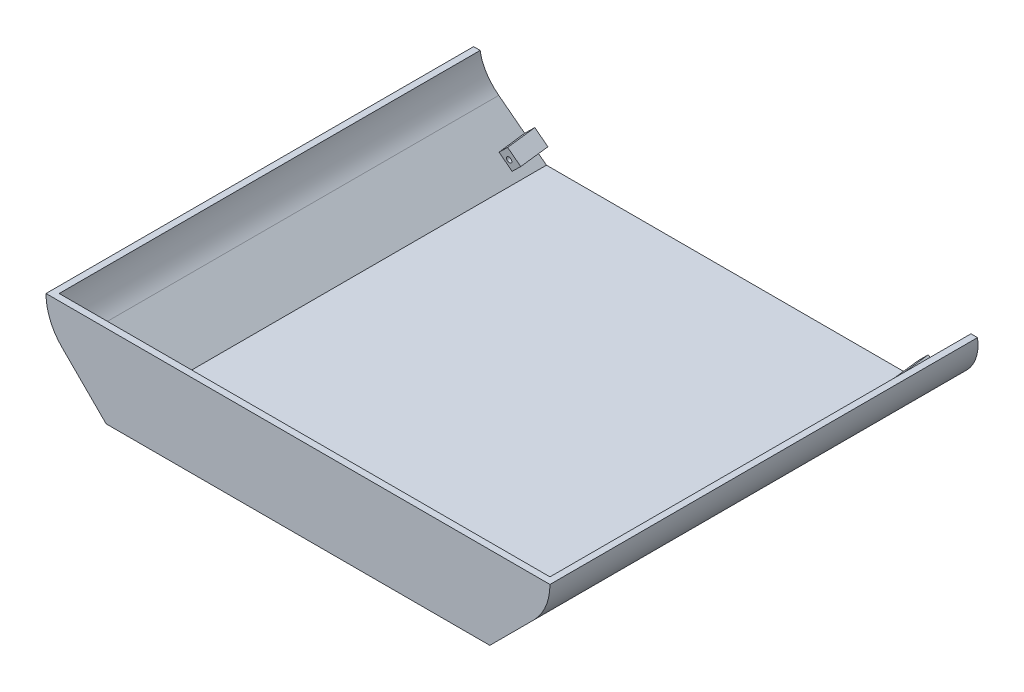
ISO-10303-21;
HEADER;
FILE_DESCRIPTION(('STEP AP214'),'2;1');
FILE_NAME('part.step','',(''),(''),'','','');
FILE_SCHEMA(('AUTOMOTIVE_DESIGN { 1 0 10303 214 1 1 1 1 }'));
ENDSEC;
DATA;
#1=APPLICATION_CONTEXT('core data for automotive mechanical design processes');
#2=APPLICATION_PROTOCOL_DEFINITION('international standard','automotive_design',2000,#1);
#3=PRODUCT_CONTEXT('',#1,'mechanical');
#4=PRODUCT('Part','Part','',(#3));
#5=PRODUCT_RELATED_PRODUCT_CATEGORY('part','',(#4));
#6=PRODUCT_DEFINITION_FORMATION('','',#4);
#7=PRODUCT_DEFINITION_CONTEXT('part definition',#1,'design');
#8=PRODUCT_DEFINITION('design','',#6,#7);
#9=PRODUCT_DEFINITION_SHAPE('','',#8);
#10=(LENGTH_UNIT() NAMED_UNIT(*) SI_UNIT(.MILLI.,.METRE.));
#11=(NAMED_UNIT(*) PLANE_ANGLE_UNIT() SI_UNIT($,.RADIAN.));
#12=(NAMED_UNIT(*) SI_UNIT($,.STERADIAN.) SOLID_ANGLE_UNIT());
#13=UNCERTAINTY_MEASURE_WITH_UNIT(LENGTH_MEASURE(1.E-05),#10,'distance_accuracy_value','');
#14=(GEOMETRIC_REPRESENTATION_CONTEXT(3) GLOBAL_UNCERTAINTY_ASSIGNED_CONTEXT((#13)) GLOBAL_UNIT_ASSIGNED_CONTEXT((#10,
#11,#12)) REPRESENTATION_CONTEXT('',''));
#15=CARTESIAN_POINT('',(0.,0.,0.));
#16=DIRECTION('',(0.,0.,1.));
#17=DIRECTION('',(1.,0.,0.));
#18=AXIS2_PLACEMENT_3D('',#15,#16,#17);
#19=CARTESIAN_POINT('',(170.757359312881,4.24264068711929,400.));
#20=DIRECTION('',(-0.707106781186546,0.707106781186549,0.));
#21=DIRECTION('',(-0.707106781186549,-0.707106781186546,0.));
#22=AXIS2_PLACEMENT_3D('',#19,#20,#21);
#23=PLANE('',#22);
#24=DIRECTION('',(0.704062592219638,0.704062592219636,0.0926915987235618));
#25=VECTOR('',#24,1.);
#26=CARTESIAN_POINT('',(195.179587109526,28.6648684837644,28.9895255434052));
#27=LINE('',#26,#25);
#28=CARTESIAN_POINT('',(177.909749068652,11.395030442891,26.7159082323946));
#29=VERTEX_POINT('',#28);
#30=CARTESIAN_POINT('',(188.470687951947,21.9559693261855,28.106282213248));
#31=VERTEX_POINT('',#30);
#32=EDGE_CURVE('E57',#29,#31,#27,.T.);
#33=ORIENTED_EDGE('',*,*,#32,.F.);
#34=DIRECTION('',(0.0655428580164528,0.0655428580164526,-0.995694866676569));
#35=VECTOR('',#34,1.);
#36=CARTESIAN_POINT('',(153.487521272007,-13.0271973537541,397.726382688989));
#37=LINE('',#36,#35);
#38=CARTESIAN_POINT('',(179.555344547958,13.0406259221963,1.71683097275991));
#39=VERTEX_POINT('',#38);
#40=EDGE_CURVE('E11',#29,#39,#37,.T.);
#41=ORIENTED_EDGE('',*,*,#40,.T.);
#42=DIRECTION('',(-0.704062592219638,-0.704062592219636,-0.0926915987235618));
#43=VECTOR('',#42,1.);
#44=CARTESIAN_POINT('',(196.825182588831,30.3104639630699,3.99044828377049));
#45=LINE('',#44,#43);
#46=CARTESIAN_POINT('',(172.514718625761,6.,0.789914985524294));
#47=VERTEX_POINT('',#46);
#48=EDGE_CURVE('E260',#39,#47,#45,.T.);
#49=ORIENTED_EDGE('',*,*,#48,.T.);
#50=DIRECTION('',(0.,0.,-1.));
#51=VECTOR('',#50,1.);
#52=CARTESIAN_POINT('',(172.514718625761,6.,400.));
#53=LINE('',#52,#51);
#54=CARTESIAN_POINT('',(172.514718625761,6.,394.));
#55=VERTEX_POINT('',#54);
#56=EDGE_CURVE('E241',#55,#47,#53,.T.);
#57=ORIENTED_EDGE('',*,*,#56,.F.);
#58=DIRECTION('',(0.707106781186549,0.707106781186546,0.));
#59=VECTOR('',#58,1.);
#60=CARTESIAN_POINT('',(170.757359312881,4.24264068711929,394.));
#61=LINE('',#60,#59);
#62=CARTESIAN_POINT('',(210.976193119776,44.4614744940144,394.));
#63=VERTEX_POINT('',#62);
#64=EDGE_CURVE('E236',#55,#63,#61,.T.);
#65=ORIENTED_EDGE('',*,*,#64,.T.);
#66=DIRECTION('',(0.,0.,-1.));
#67=VECTOR('',#66,1.);
#68=CARTESIAN_POINT('',(210.976193119776,44.4614744940144,400.));
#69=LINE('',#68,#67);
#70=CARTESIAN_POINT('',(210.976193119776,44.4614744940144,5.85346416355464));
#71=VERTEX_POINT('',#70);
#72=EDGE_CURVE('E231',#63,#71,#69,.T.);
#73=ORIENTED_EDGE('',*,*,#72,.T.);
#74=CARTESIAN_POINT('',(190.116283431252,23.601564805491,3.10720495361334));
#75=VERTEX_POINT('',#74);
#76=EDGE_CURVE('E258',#71,#75,#45,.T.);
#77=ORIENTED_EDGE('',*,*,#76,.T.);
#78=DIRECTION('',(-0.0655428580164527,-0.0655428580164525,0.995694866676569));
#79=VECTOR('',#78,1.);
#80=CARTESIAN_POINT('',(164.048460155302,-2.46625847045953,399.116756669843));
#81=LINE('',#80,#79);
#82=EDGE_CURVE('E47',#75,#31,#81,.T.);
#83=ORIENTED_EDGE('',*,*,#82,.T.);
#84=EDGE_LOOP('',(#33,#41,#49,#57,#65,#73,#77,#83));
#85=FACE_BOUND('',#84,.T.);
#86=ADVANCED_FACE('F38',(#85),#23,.T.);
#87=CARTESIAN_POINT('',(-170.757359312881,4.24264068711931,400.));
#88=DIRECTION('',(0.707106781186543,0.707106781186552,0.));
#89=DIRECTION('',(-0.707106781186552,0.707106781186543,0.));
#90=AXIS2_PLACEMENT_3D('',#87,#88,#89);
#91=PLANE('',#90);
#92=DIRECTION('',(-0.704062592219641,0.704062592219633,0.0926915987235614));
#93=VECTOR('',#92,1.);
#94=CARTESIAN_POINT('',(-196.825182588831,30.3104639630696,3.99044828377049));
#95=LINE('',#94,#93);
#96=CARTESIAN_POINT('',(-172.514718625761,6.,0.789914985524294));
#97=VERTEX_POINT('',#96);
#98=CARTESIAN_POINT('',(-179.555344547958,13.0406259221963,1.71683097275993));
#99=VERTEX_POINT('',#98);
#100=EDGE_CURVE('E263',#97,#99,#95,.T.);
#101=ORIENTED_EDGE('',*,*,#100,.T.);
#102=DIRECTION('',(0.0655428580164531,-0.0655428580164523,0.995694866676569));
#103=VECTOR('',#102,1.);
#104=CARTESIAN_POINT('',(-153.487521272007,-13.027197353754,397.726382688989));
#105=LINE('',#104,#103);
#106=CARTESIAN_POINT('',(-177.909749068652,11.3950304428909,26.7159082323946));
#107=VERTEX_POINT('',#106);
#108=EDGE_CURVE('E331',#99,#107,#105,.T.);
#109=ORIENTED_EDGE('',*,*,#108,.T.);
#110=DIRECTION('',(-0.704062592219642,0.704062592219633,0.0926915987235614));
#111=VECTOR('',#110,1.);
#112=CARTESIAN_POINT('',(-195.179587109526,28.6648684837642,28.9895255434052));
#113=LINE('',#112,#111);
#114=CARTESIAN_POINT('',(-188.470687951947,21.9559693261854,28.106282213248));
#115=VERTEX_POINT('',#114);
#116=EDGE_CURVE('E326',#107,#115,#113,.T.);
#117=ORIENTED_EDGE('',*,*,#116,.T.);
#118=DIRECTION('',(-0.065542858016453,0.0655428580164522,-0.995694866676569));
#119=VECTOR('',#118,1.);
#120=CARTESIAN_POINT('',(-164.048460155302,-2.46625847045949,399.116756669843));
#121=LINE('',#120,#119);
#122=CARTESIAN_POINT('',(-190.116283431252,23.6015648054908,3.10720495361333));
#123=VERTEX_POINT('',#122);
#124=EDGE_CURVE('E328',#115,#123,#121,.T.);
#125=ORIENTED_EDGE('',*,*,#124,.T.);
#126=CARTESIAN_POINT('',(-210.976193119776,44.4614744940139,5.85346416355459));
#127=VERTEX_POINT('',#126);
#128=EDGE_CURVE('E266',#123,#127,#95,.T.);
#129=ORIENTED_EDGE('',*,*,#128,.T.);
#130=DIRECTION('',(0.,0.,1.));
#131=VECTOR('',#130,1.);
#132=CARTESIAN_POINT('',(-210.976193119776,44.4614744940139,400.));
#133=LINE('',#132,#131);
#134=CARTESIAN_POINT('',(-210.976193119776,44.4614744940139,394.));
#135=VERTEX_POINT('',#134);
#136=EDGE_CURVE('E253',#135,#127,#133,.F.);
#137=ORIENTED_EDGE('',*,*,#136,.F.);
#138=DIRECTION('',(0.707106781186552,-0.707106781186543,0.));
#139=VECTOR('',#138,1.);
#140=CARTESIAN_POINT('',(-170.757359312881,4.24264068711931,394.));
#141=LINE('',#140,#139);
#142=CARTESIAN_POINT('',(-172.514718625761,6.,394.));
#143=VERTEX_POINT('',#142);
#144=EDGE_CURVE('E248',#135,#143,#141,.T.);
#145=ORIENTED_EDGE('',*,*,#144,.T.);
#146=DIRECTION('',(0.,0.,-1.));
#147=VECTOR('',#146,1.);
#148=CARTESIAN_POINT('',(-172.514718625761,6.,400.));
#149=LINE('',#148,#147);
#150=EDGE_CURVE('E244',#143,#97,#149,.T.);
#151=ORIENTED_EDGE('',*,*,#150,.T.);
#152=EDGE_LOOP('',(#101,#109,#117,#125,#129,#137,#145,#151));
#153=FACE_BOUND('',#152,.T.);
#154=ADVANCED_FACE('F365',(#153),#91,.T.);
#155=CARTESIAN_POINT('',(175.,0.,400.));
#156=DIRECTION('',(-0.707106781186546,0.707106781186549,0.));
#157=DIRECTION('',(-0.707106781186549,-0.707106781186546,0.));
#158=AXIS2_PLACEMENT_3D('',#155,#156,#157);
#159=PLANE('',#158);
#160=DIRECTION('',(-0.704062592219638,-0.704062592219636,-0.0926915987235618));
#161=VECTOR('',#160,1.);
#162=CARTESIAN_POINT('',(201.104274909717,26.1042749097173,3.43669298957194));
#163=LINE('',#162,#161);
#164=CARTESIAN_POINT('',(215.218833806895,40.2188338068951,5.29490992072962));
#165=VERTEX_POINT('',#164);
#166=CARTESIAN_POINT('',(175.,0.,0.));
#167=VERTEX_POINT('',#166);
#168=EDGE_CURVE('E292',#165,#167,#163,.T.);
#169=ORIENTED_EDGE('',*,*,#168,.F.);
#170=DIRECTION('',(0.,0.,-1.));
#171=VECTOR('',#170,1.);
#172=CARTESIAN_POINT('',(215.218833806895,40.2188338068951,400.));
#173=LINE('',#172,#171);
#174=CARTESIAN_POINT('',(215.218833806895,40.2188338068951,400.));
#175=VERTEX_POINT('',#174);
#176=EDGE_CURVE('E323',#175,#165,#173,.T.);
#177=ORIENTED_EDGE('',*,*,#176,.F.);
#178=DIRECTION('',(0.707106781186549,0.707106781186546,0.));
#179=VECTOR('',#178,1.);
#180=CARTESIAN_POINT('',(175.,0.,400.));
#181=LINE('',#180,#179);
#182=CARTESIAN_POINT('',(175.,0.,400.));
#183=VERTEX_POINT('',#182);
#184=EDGE_CURVE('E295',#183,#175,#181,.T.);
#185=ORIENTED_EDGE('',*,*,#184,.F.);
#186=DIRECTION('',(0.,0.,-1.));
#187=VECTOR('',#186,1.);
#188=CARTESIAN_POINT('',(175.,0.,400.));
#189=LINE('',#188,#187);
#190=EDGE_CURVE('E307',#183,#167,#189,.T.);
#191=ORIENTED_EDGE('',*,*,#190,.T.);
#192=EDGE_LOOP('',(#169,#177,#185,#191));
#193=FACE_BOUND('',#192,.T.);
#194=ADVANCED_FACE('F40',(#193),#159,.F.);
#195=CARTESIAN_POINT('',(179.863494747568,75.5741728662225,400.));
#196=DIRECTION('',(0.,0.,-1.));
#197=DIRECTION('',(-1.,0.,0.));
#198=AXIS2_PLACEMENT_3D('',#195,#196,#197);
#199=CYLINDRICAL_SURFACE('',#198,50.);
#200=CARTESIAN_POINT('',(179.863494747568,75.5741728662225,9.94952861093878));
#201=DIRECTION('',(0.,0.130526192220038,-0.991444861373812));
#202=DIRECTION('',(0.,-0.991444861373812,-0.130526192220038));
#203=AXIS2_PLACEMENT_3D('',#200,#201,#202);
#204=ELLIPSE('',#203,50.4314480290075,50.);
#205=CARTESIAN_POINT('',(229.863494747568,75.5741721608928,9.94952851808034));
#206=VERTEX_POINT('',#205);
#207=EDGE_CURVE('E290',#206,#165,#204,.T.);
#208=ORIENTED_EDGE('',*,*,#207,.F.);
#209=DIRECTION('',(0.,0.,-1.));
#210=VECTOR('',#209,1.);
#211=CARTESIAN_POINT('',(229.863494747568,75.5741720841793,400.));
#212=LINE('',#211,#210);
#213=CARTESIAN_POINT('',(229.863494747568,75.5741720841793,400.));
#214=VERTEX_POINT('',#213);
#215=EDGE_CURVE('E321',#214,#206,#212,.T.);
#216=ORIENTED_EDGE('',*,*,#215,.F.);
#217=CARTESIAN_POINT('',(179.863494747568,75.5741728662225,400.));
#218=DIRECTION('',(0.,0.,1.));
#219=DIRECTION('',(1.,0.,0.));
#220=AXIS2_PLACEMENT_3D('',#217,#218,#219);
#221=CIRCLE('',#220,50.);
#222=EDGE_CURVE('E298',#175,#214,#221,.T.);
#223=ORIENTED_EDGE('',*,*,#222,.F.);
#224=ORIENTED_EDGE('',*,*,#176,.T.);
#225=EDGE_LOOP('',(#208,#216,#223,#224));
#226=FACE_BOUND('',#225,.T.);
#227=ADVANCED_FACE('F409',(#226),#199,.T.);
#228=CARTESIAN_POINT('',(-179.863494747568,75.5741728662222,400.));
#229=DIRECTION('',(0.,0.,-1.));
#230=DIRECTION('',(-1.,0.,0.));
#231=AXIS2_PLACEMENT_3D('',#228,#229,#230);
#232=CYLINDRICAL_SURFACE('',#231,50.);
#233=CARTESIAN_POINT('',(-179.863494747568,75.5741728662222,9.94952861093873));
#234=DIRECTION('',(0.,0.130526192220038,-0.991444861373812));
#235=DIRECTION('',(0.,-0.991444861373812,-0.130526192220038));
#236=AXIS2_PLACEMENT_3D('',#233,#234,#235);
#237=ELLIPSE('',#236,50.4314480290075,50.);
#238=CARTESIAN_POINT('',(-215.218833806895,40.2188338068946,5.29490992072952));
#239=VERTEX_POINT('',#238);
#240=CARTESIAN_POINT('',(-229.863494747568,75.5741721608927,9.94952851808034));
#241=VERTEX_POINT('',#240);
#242=EDGE_CURVE('E287',#239,#241,#237,.T.);
#243=ORIENTED_EDGE('',*,*,#242,.F.);
#244=DIRECTION('',(0.,0.,-1.));
#245=VECTOR('',#244,1.);
#246=CARTESIAN_POINT('',(-215.218833806895,40.2188338068946,400.));
#247=LINE('',#246,#245);
#248=CARTESIAN_POINT('',(-215.218833806895,40.2188338068946,400.));
#249=VERTEX_POINT('',#248);
#250=EDGE_CURVE('E315',#249,#239,#247,.T.);
#251=ORIENTED_EDGE('',*,*,#250,.F.);
#252=CARTESIAN_POINT('',(-179.863494747568,75.5741728662222,400.));
#253=DIRECTION('',(0.,0.,1.));
#254=DIRECTION('',(-1.,0.,0.));
#255=AXIS2_PLACEMENT_3D('',#252,#253,#254);
#256=CIRCLE('',#255,50.);
#257=CARTESIAN_POINT('',(-229.863494747568,75.5741720841793,400.));
#258=VERTEX_POINT('',#257);
#259=EDGE_CURVE('E301',#258,#249,#256,.T.);
#260=ORIENTED_EDGE('',*,*,#259,.F.);
#261=DIRECTION('',(0.,0.,-1.));
#262=VECTOR('',#261,1.);
#263=CARTESIAN_POINT('',(-229.863494747568,75.5741720841793,400.));
#264=LINE('',#263,#262);
#265=EDGE_CURVE('E318',#258,#241,#264,.T.);
#266=ORIENTED_EDGE('',*,*,#265,.T.);
#267=EDGE_LOOP('',(#243,#251,#260,#266));
#268=FACE_BOUND('',#267,.T.);
#269=ADVANCED_FACE('F406',(#268),#232,.T.);
#270=CARTESIAN_POINT('',(-175.,0.,400.));
#271=DIRECTION('',(0.707106781186543,0.707106781186552,0.));
#272=DIRECTION('',(-0.707106781186552,0.707106781186543,0.));
#273=AXIS2_PLACEMENT_3D('',#270,#271,#272);
#274=PLANE('',#273);
#275=DIRECTION('',(-0.704062592219641,0.704062592219633,0.0926915987235614));
#276=VECTOR('',#275,1.);
#277=CARTESIAN_POINT('',(-201.104274909717,26.1042749097171,3.43669298957189));
#278=LINE('',#277,#276);
#279=CARTESIAN_POINT('',(-175.,0.,0.));
#280=VERTEX_POINT('',#279);
#281=EDGE_CURVE('E285',#280,#239,#278,.T.);
#282=ORIENTED_EDGE('',*,*,#281,.F.);
#283=DIRECTION('',(0.,0.,-1.));
#284=VECTOR('',#283,1.);
#285=CARTESIAN_POINT('',(-175.,0.,400.));
#286=LINE('',#285,#284);
#287=CARTESIAN_POINT('',(-175.,0.,400.));
#288=VERTEX_POINT('',#287);
#289=EDGE_CURVE('E312',#288,#280,#286,.T.);
#290=ORIENTED_EDGE('',*,*,#289,.F.);
#291=DIRECTION('',(0.707106781186552,-0.707106781186543,0.));
#292=VECTOR('',#291,1.);
#293=CARTESIAN_POINT('',(-175.,0.,400.));
#294=LINE('',#293,#292);
#295=EDGE_CURVE('E303',#249,#288,#294,.T.);
#296=ORIENTED_EDGE('',*,*,#295,.F.);
#297=ORIENTED_EDGE('',*,*,#250,.T.);
#298=EDGE_LOOP('',(#282,#290,#296,#297));
#299=FACE_BOUND('',#298,.T.);
#300=ADVANCED_FACE('F402',(#299),#274,.F.);
#301=CARTESIAN_POINT('',(-175.,0.,400.));
#302=DIRECTION('',(0.,1.,0.));
#303=DIRECTION('',(-1.,0.,0.));
#304=AXIS2_PLACEMENT_3D('',#301,#302,#303);
#305=PLANE('',#304);
#306=DIRECTION('',(1.,0.,0.));
#307=VECTOR('',#306,1.);
#308=CARTESIAN_POINT('',(-175.,0.,0.));
#309=LINE('',#308,#307);
#310=EDGE_CURVE('E294',#280,#167,#309,.T.);
#311=ORIENTED_EDGE('',*,*,#310,.T.);
#312=ORIENTED_EDGE('',*,*,#190,.F.);
#313=DIRECTION('',(1.,0.,0.));
#314=VECTOR('',#313,1.);
#315=CARTESIAN_POINT('',(-175.,0.,400.));
#316=LINE('',#315,#314);
#317=EDGE_CURVE('E305',#288,#183,#316,.T.);
#318=ORIENTED_EDGE('',*,*,#317,.F.);
#319=ORIENTED_EDGE('',*,*,#289,.T.);
#320=EDGE_LOOP('',(#311,#312,#318,#319));
#321=FACE_BOUND('',#320,.T.);
#322=ADVANCED_FACE('F398',(#321),#305,.F.);
#323=CARTESIAN_POINT('',(179.863494747568,75.5741728662225,400.));
#324=DIRECTION('',(0.,0.,1.));
#325=DIRECTION('',(1.,0.,0.));
#326=AXIS2_PLACEMENT_3D('',#323,#324,#325);
#327=PLANE('',#326);
#328=DIRECTION('',(1.,0.,0.));
#329=VECTOR('',#328,1.);
#330=CARTESIAN_POINT('',(-310.,75.5741720841793,400.));
#331=LINE('',#330,#329);
#332=EDGE_CURVE('E234',#258,#214,#331,.T.);
#333=ORIENTED_EDGE('',*,*,#332,.F.);
#334=ORIENTED_EDGE('',*,*,#259,.T.);
#335=ORIENTED_EDGE('',*,*,#295,.T.);
#336=ORIENTED_EDGE('',*,*,#317,.T.);
#337=ORIENTED_EDGE('',*,*,#184,.T.);
#338=ORIENTED_EDGE('',*,*,#222,.T.);
#339=EDGE_LOOP('',(#333,#334,#335,#336,#337,#338));
#340=FACE_BOUND('',#339,.T.);
#341=ADVANCED_FACE('F395',(#340),#327,.T.);
#342=CARTESIAN_POINT('',(0.,0.,0.));
#343=DIRECTION('',(0.,0.130526192220038,-0.991444861373812));
#344=DIRECTION('',(0.,0.991444861373812,0.130526192220038));
#345=AXIS2_PLACEMENT_3D('',#342,#343,#344);
#346=PLANE('',#345);
#347=CARTESIAN_POINT('',(179.509779585301,23.5563896574063,3.10125753253912));
#348=DIRECTION('',(0.,-0.130526192220038,0.991444861373812));
#349=DIRECTION('',(0.,-0.991444861373812,-0.130526192220038));
#350=AXIS2_PLACEMENT_3D('',#347,#348,#349);
#351=CIRCLE('',#350,2.5);
#352=CARTESIAN_POINT('',(179.509779585301,21.0777775039718,2.77494205198902));
#353=VERTEX_POINT('',#352);
#354=EDGE_CURVE('E336',#353,#353,#351,.T.);
#355=ORIENTED_EDGE('',*,*,#354,.T.);
#356=EDGE_LOOP('',(#355));
#357=FACE_BOUND('',#356,.T.);
#358=CARTESIAN_POINT('',(-179.509779585301,23.5563896574063,3.10125753253912));
#359=DIRECTION('',(0.,-0.130526192220038,0.991444861373812));
#360=DIRECTION('',(0.,0.991444861373812,0.130526192220038));
#361=AXIS2_PLACEMENT_3D('',#358,#359,#360);
#362=CIRCLE('',#361,2.5);
#363=CARTESIAN_POINT('',(-179.509779585301,26.0350018108408,3.42757301308922));
#364=VERTEX_POINT('',#363);
#365=EDGE_CURVE('E341',#364,#364,#362,.T.);
#366=ORIENTED_EDGE('',*,*,#365,.T.);
#367=EDGE_LOOP('',(#366));
#368=FACE_BOUND('',#367,.T.);
#369=DIRECTION('',(-1.,0.,0.));
#370=VECTOR('',#369,1.);
#371=CARTESIAN_POINT('',(0.,75.5741721608927,9.94952851808035));
#372=LINE('',#371,#370);
#373=CARTESIAN_POINT('',(223.863494747568,75.5741721608927,9.94952851808037));
#374=VERTEX_POINT('',#373);
#375=EDGE_CURVE('E230',#206,#374,#372,.T.);
#376=ORIENTED_EDGE('',*,*,#375,.F.);
#377=ORIENTED_EDGE('',*,*,#207,.T.);
#378=ORIENTED_EDGE('',*,*,#168,.T.);
#379=ORIENTED_EDGE('',*,*,#310,.F.);
#380=ORIENTED_EDGE('',*,*,#281,.T.);
#381=ORIENTED_EDGE('',*,*,#242,.T.);
#382=CARTESIAN_POINT('',(-223.863494747568,75.5741721608927,9.94952851808034));
#383=VERTEX_POINT('',#382);
#384=EDGE_CURVE('E228',#383,#241,#372,.T.);
#385=ORIENTED_EDGE('',*,*,#384,.F.);
#386=CARTESIAN_POINT('',(-179.863494747568,75.5741728662222,9.94952861093873));
#387=DIRECTION('',(0.,0.130526192220038,-0.991444861373812));
#388=DIRECTION('',(0.,-0.991444861373812,-0.130526192220038));
#389=AXIS2_PLACEMENT_3D('',#386,#387,#388);
#390=ELLIPSE('',#389,44.3796742655266,44.);
#391=EDGE_CURVE('E265',#127,#383,#390,.T.);
#392=ORIENTED_EDGE('',*,*,#391,.F.);
#393=ORIENTED_EDGE('',*,*,#128,.F.);
#394=DIRECTION('',(-0.710137920573855,-0.69803923914169,-0.0918986092469996));
#395=VECTOR('',#394,1.);
#396=CARTESIAN_POINT('',(-190.116283431252,23.6015648054908,3.10720495361333));
#397=LINE('',#396,#395);
#398=CARTESIAN_POINT('',(-179.464214622645,34.0721533926162,4.48568409231832));
#399=VERTEX_POINT('',#398);
#400=EDGE_CURVE('E214',#399,#123,#397,.T.);
#401=ORIENTED_EDGE('',*,*,#400,.F.);
#402=DIRECTION('',(-0.704062592219642,0.704062592219632,0.0926915987235613));
#403=VECTOR('',#402,1.);
#404=CARTESIAN_POINT('',(-179.464214622645,34.0721533926162,4.48568409231832));
#405=LINE('',#404,#403);
#406=CARTESIAN_POINT('',(-168.90327573935,23.5112145093217,3.0953101114649));
#407=VERTEX_POINT('',#406);
#408=EDGE_CURVE('E202',#407,#399,#405,.T.);
#409=ORIENTED_EDGE('',*,*,#408,.F.);
#410=DIRECTION('',(0.710137920573856,0.698039239141689,0.0918986092469994));
#411=VECTOR('',#410,1.);
#412=CARTESIAN_POINT('',(-168.90327573935,23.5112145093217,3.0953101114649));
#413=LINE('',#412,#411);
#414=EDGE_CURVE('E199',#99,#407,#413,.T.);
#415=ORIENTED_EDGE('',*,*,#414,.F.);
#416=ORIENTED_EDGE('',*,*,#100,.F.);
#417=DIRECTION('',(1.,0.,0.));
#418=VECTOR('',#417,1.);
#419=CARTESIAN_POINT('',(0.,6.,0.789914985524294));
#420=LINE('',#419,#418);
#421=EDGE_CURVE('E240',#97,#47,#420,.T.);
#422=ORIENTED_EDGE('',*,*,#421,.T.);
#423=ORIENTED_EDGE('',*,*,#48,.F.);
#424=DIRECTION('',(0.710137920573856,-0.698039239141689,-0.0918986092469994));
#425=VECTOR('',#424,1.);
#426=CARTESIAN_POINT('',(168.90327573935,23.5112145093217,3.0953101114649));
#427=LINE('',#426,#425);
#428=CARTESIAN_POINT('',(168.90327573935,23.5112145093217,3.0953101114649));
#429=VERTEX_POINT('',#428);
#430=EDGE_CURVE('E183',#429,#39,#427,.T.);
#431=ORIENTED_EDGE('',*,*,#430,.F.);
#432=DIRECTION('',(-0.704062592219642,-0.704062592219632,-0.0926915987235613));
#433=VECTOR('',#432,1.);
#434=CARTESIAN_POINT('',(179.464214622645,34.0721533926162,4.48568409231832));
#435=LINE('',#434,#433);
#436=CARTESIAN_POINT('',(179.464214622645,34.0721533926162,4.48568409231832));
#437=VERTEX_POINT('',#436);
#438=EDGE_CURVE('E190',#437,#429,#435,.T.);
#439=ORIENTED_EDGE('',*,*,#438,.F.);
#440=DIRECTION('',(-0.710137920573855,0.69803923914169,0.0918986092469996));
#441=VECTOR('',#440,1.);
#442=CARTESIAN_POINT('',(190.116283431252,23.6015648054908,3.10720495361333));
#443=LINE('',#442,#441);
#444=EDGE_CURVE('E174',#75,#437,#443,.T.);
#445=ORIENTED_EDGE('',*,*,#444,.F.);
#446=ORIENTED_EDGE('',*,*,#76,.F.);
#447=CARTESIAN_POINT('',(179.863494747568,75.5741728662225,9.94952861093878));
#448=DIRECTION('',(0.,0.130526192220038,-0.991444861373812));
#449=DIRECTION('',(0.,-0.991444861373812,-0.130526192220038));
#450=AXIS2_PLACEMENT_3D('',#447,#448,#449);
#451=ELLIPSE('',#450,44.3796742655266,44.);
#452=EDGE_CURVE('E269',#374,#71,#451,.T.);
#453=ORIENTED_EDGE('',*,*,#452,.F.);
#454=EDGE_LOOP('',(#376,#377,#378,#379,#380,#381,#385,#392,#393,#401,#409,#415,#416,#422,#423,
#431,#439,#445,#446,#453));
#455=FACE_BOUND('',#454,.T.);
#456=ADVANCED_FACE('F196',(#357,#368,#455),#346,.T.);
#457=CARTESIAN_POINT('',(179.863494747568,75.5741728662225,400.));
#458=DIRECTION('',(0.,0.,-1.));
#459=DIRECTION('',(-1.,0.,0.));
#460=AXIS2_PLACEMENT_3D('',#457,#458,#459);
#461=CYLINDRICAL_SURFACE('',#460,44.);
#462=ORIENTED_EDGE('',*,*,#452,.T.);
#463=ORIENTED_EDGE('',*,*,#72,.F.);
#464=CARTESIAN_POINT('',(179.863494747568,75.5741728662225,394.));
#465=DIRECTION('',(0.,0.,1.));
#466=DIRECTION('',(1.,0.,0.));
#467=AXIS2_PLACEMENT_3D('',#464,#465,#466);
#468=CIRCLE('',#467,44.);
#469=CARTESIAN_POINT('',(223.863494747568,75.5741721612645,394.));
#470=VERTEX_POINT('',#469);
#471=EDGE_CURVE('E239',#63,#470,#468,.T.);
#472=ORIENTED_EDGE('',*,*,#471,.T.);
#473=DIRECTION('',(0.,0.,-1.));
#474=VECTOR('',#473,1.);
#475=CARTESIAN_POINT('',(223.863494747568,75.5741721780245,400.));
#476=LINE('',#475,#474);
#477=EDGE_CURVE('E235',#470,#374,#476,.T.);
#478=ORIENTED_EDGE('',*,*,#477,.T.);
#479=EDGE_LOOP('',(#462,#463,#472,#478));
#480=FACE_BOUND('',#479,.T.);
#481=ADVANCED_FACE('F377',(#480),#461,.F.);
#482=CARTESIAN_POINT('',(-179.863494747568,75.5741728662222,400.));
#483=DIRECTION('',(0.,0.,-1.));
#484=DIRECTION('',(-1.,0.,0.));
#485=AXIS2_PLACEMENT_3D('',#482,#483,#484);
#486=CYLINDRICAL_SURFACE('',#485,44.);
#487=ORIENTED_EDGE('',*,*,#391,.T.);
#488=DIRECTION('',(0.,0.,-1.));
#489=VECTOR('',#488,1.);
#490=CARTESIAN_POINT('',(-223.863494747568,75.5741721780245,400.));
#491=LINE('',#490,#489);
#492=CARTESIAN_POINT('',(-223.863494747568,75.5741720841793,394.));
#493=VERTEX_POINT('',#492);
#494=EDGE_CURVE('E251',#493,#383,#491,.T.);
#495=ORIENTED_EDGE('',*,*,#494,.F.);
#496=CARTESIAN_POINT('',(-179.863494747568,75.5741728662222,394.));
#497=DIRECTION('',(0.,0.,1.));
#498=DIRECTION('',(1.,0.,0.));
#499=AXIS2_PLACEMENT_3D('',#496,#497,#498);
#500=CIRCLE('',#499,44.);
#501=EDGE_CURVE('E246',#493,#135,#500,.T.);
#502=ORIENTED_EDGE('',*,*,#501,.T.);
#503=ORIENTED_EDGE('',*,*,#136,.T.);
#504=EDGE_LOOP('',(#487,#495,#502,#503));
#505=FACE_BOUND('',#504,.T.);
#506=ADVANCED_FACE('F380',(#505),#486,.F.);
#507=CARTESIAN_POINT('',(-175.,6.,400.));
#508=DIRECTION('',(0.,1.,0.));
#509=DIRECTION('',(-1.,0.,0.));
#510=AXIS2_PLACEMENT_3D('',#507,#508,#509);
#511=PLANE('',#510);
#512=ORIENTED_EDGE('',*,*,#421,.F.);
#513=ORIENTED_EDGE('',*,*,#150,.F.);
#514=DIRECTION('',(1.,0.,0.));
#515=VECTOR('',#514,1.);
#516=CARTESIAN_POINT('',(-175.,6.,394.));
#517=LINE('',#516,#515);
#518=EDGE_CURVE('E245',#143,#55,#517,.T.);
#519=ORIENTED_EDGE('',*,*,#518,.T.);
#520=ORIENTED_EDGE('',*,*,#56,.T.);
#521=EDGE_LOOP('',(#512,#513,#519,#520));
#522=FACE_BOUND('',#521,.T.);
#523=ADVANCED_FACE('F383',(#522),#511,.T.);
#524=CARTESIAN_POINT('',(179.863494747568,75.5741728662225,394.));
#525=DIRECTION('',(0.,0.,1.));
#526=DIRECTION('',(1.,0.,0.));
#527=AXIS2_PLACEMENT_3D('',#524,#525,#526);
#528=PLANE('',#527);
#529=DIRECTION('',(1.,0.,0.));
#530=VECTOR('',#529,1.);
#531=CARTESIAN_POINT('',(-310.,75.5741720841793,394.));
#532=LINE('',#531,#530);
#533=EDGE_CURVE('E271',#493,#470,#532,.T.);
#534=ORIENTED_EDGE('',*,*,#533,.T.);
#535=ORIENTED_EDGE('',*,*,#471,.F.);
#536=ORIENTED_EDGE('',*,*,#64,.F.);
#537=ORIENTED_EDGE('',*,*,#518,.F.);
#538=ORIENTED_EDGE('',*,*,#144,.F.);
#539=ORIENTED_EDGE('',*,*,#501,.F.);
#540=EDGE_LOOP('',(#534,#535,#536,#537,#538,#539));
#541=FACE_BOUND('',#540,.T.);
#542=ADVANCED_FACE('F388',(#541),#528,.F.);
#543=CARTESIAN_POINT('',(-239.863494747568,75.5741721608927,-1.2E-05));
#544=DIRECTION('',(0.,-1.,0.));
#545=DIRECTION('',(0.,0.,-1.));
#546=AXIS2_PLACEMENT_3D('',#543,#544,#545);
#547=PLANE('',#546);
#548=ORIENTED_EDGE('',*,*,#375,.T.);
#549=ORIENTED_EDGE('',*,*,#477,.F.);
#550=ORIENTED_EDGE('',*,*,#533,.F.);
#551=ORIENTED_EDGE('',*,*,#494,.T.);
#552=ORIENTED_EDGE('',*,*,#384,.T.);
#553=ORIENTED_EDGE('',*,*,#265,.F.);
#554=ORIENTED_EDGE('',*,*,#332,.T.);
#555=ORIENTED_EDGE('',*,*,#215,.T.);
#556=EDGE_LOOP('',(#548,#549,#550,#551,#552,#553,#554,#555));
#557=FACE_BOUND('',#556,.T.);
#558=ADVANCED_FACE('F375',(#557),#547,.F.);
#559=CARTESIAN_POINT('',(-168.90327573935,20.2480597038207,27.8814316458102));
#560=DIRECTION('',(-0.704062592219641,0.704062592219634,0.0926915987235615));
#561=DIRECTION('',(-0.707106781186544,-0.707106781186551,0.));
#562=AXIS2_PLACEMENT_3D('',#559,#560,#561);
#563=PLANE('',#562);
#564=ORIENTED_EDGE('',*,*,#108,.F.);
#565=ORIENTED_EDGE('',*,*,#414,.T.);
#566=DIRECTION('',(0.,0.130526192220038,-0.991444861373812));
#567=VECTOR('',#566,1.);
#568=CARTESIAN_POINT('',(-168.90327573935,20.2480597038207,27.8814316458102));
#569=LINE('',#568,#567);
#570=CARTESIAN_POINT('',(-168.90327573935,20.2480597038207,27.8814316458102));
#571=VERTEX_POINT('',#570);
#572=EDGE_CURVE('E225',#571,#407,#569,.T.);
#573=ORIENTED_EDGE('',*,*,#572,.F.);
#574=DIRECTION('',(0.710137920573856,0.698039239141689,0.0918986092469994));
#575=VECTOR('',#574,1.);
#576=CARTESIAN_POINT('',(-168.90327573935,20.2480597038207,27.8814316458102));
#577=LINE('',#576,#575);
#578=EDGE_CURVE('E211',#107,#571,#577,.T.);
#579=ORIENTED_EDGE('',*,*,#578,.F.);
#580=EDGE_LOOP('',(#564,#565,#573,#579));
#581=FACE_BOUND('',#580,.T.);
#582=ADVANCED_FACE('F449',(#581),#563,.F.);
#583=CARTESIAN_POINT('',(-179.464214622645,30.8089985871152,29.2718056266636));
#584=DIRECTION('',(-0.710137920573854,-0.69803923914169,-0.0918986092469996));
#585=DIRECTION('',(0.701005635999189,-0.713155732149277,0.));
#586=AXIS2_PLACEMENT_3D('',#583,#584,#585);
#587=PLANE('',#586);
#588=ORIENTED_EDGE('',*,*,#408,.T.);
#589=DIRECTION('',(0.,0.130526192220038,-0.991444861373812));
#590=VECTOR('',#589,1.);
#591=CARTESIAN_POINT('',(-179.464214622645,30.8089985871152,29.2718056266636));
#592=LINE('',#591,#590);
#593=CARTESIAN_POINT('',(-179.464214622645,30.8089985871152,29.2718056266636));
#594=VERTEX_POINT('',#593);
#595=EDGE_CURVE('E218',#594,#399,#592,.T.);
#596=ORIENTED_EDGE('',*,*,#595,.F.);
#597=DIRECTION('',(-0.704062592219642,0.704062592219632,0.0926915987235613));
#598=VECTOR('',#597,1.);
#599=CARTESIAN_POINT('',(-179.464214622645,30.8089985871152,29.2718056266636));
#600=LINE('',#599,#598);
#601=EDGE_CURVE('E213',#571,#594,#600,.T.);
#602=ORIENTED_EDGE('',*,*,#601,.F.);
#603=ORIENTED_EDGE('',*,*,#572,.T.);
#604=EDGE_LOOP('',(#588,#596,#602,#603));
#605=FACE_BOUND('',#604,.T.);
#606=ADVANCED_FACE('F455',(#605),#587,.F.);
#607=CARTESIAN_POINT('',(-190.116283431252,20.3384099999899,27.8933264879586));
#608=DIRECTION('',(0.704062592219642,-0.704062592219633,-0.0926915987235614));
#609=DIRECTION('',(0.707106781186543,0.707106781186552,0.));
#610=AXIS2_PLACEMENT_3D('',#607,#608,#609);
#611=PLANE('',#610);
#612=ORIENTED_EDGE('',*,*,#124,.F.);
#613=DIRECTION('',(-0.710137920573855,-0.69803923914169,-0.0918986092469996));
#614=VECTOR('',#613,1.);
#615=CARTESIAN_POINT('',(-190.116283431252,20.3384099999899,27.8933264879586));
#616=LINE('',#615,#614);
#617=EDGE_CURVE('E216',#594,#115,#616,.T.);
#618=ORIENTED_EDGE('',*,*,#617,.F.);
#619=ORIENTED_EDGE('',*,*,#595,.T.);
#620=ORIENTED_EDGE('',*,*,#400,.T.);
#621=EDGE_LOOP('',(#612,#618,#619,#620));
#622=FACE_BOUND('',#621,.T.);
#623=ADVANCED_FACE('F461',(#622),#611,.F.);
#624=CARTESIAN_POINT('',(0.,-3.26315480550096,24.7861215343453));
#625=DIRECTION('',(0.,0.130526192220039,-0.991444861373812));
#626=DIRECTION('',(0.,0.991444861373812,0.130526192220039));
#627=AXIS2_PLACEMENT_3D('',#624,#625,#626);
#628=PLANE('',#627);
#629=CARTESIAN_POINT('',(-179.509779585301,20.2932348519053,27.8873790668844));
#630=DIRECTION('',(0.,0.130526192220039,-0.991444861373812));
#631=DIRECTION('',(0.,0.991444861373812,0.130526192220039));
#632=AXIS2_PLACEMENT_3D('',#629,#630,#631);
#633=CIRCLE('',#632,2.5);
#634=CARTESIAN_POINT('',(-179.509779585301,22.7718470053399,28.2136945474345));
#635=VERTEX_POINT('',#634);
#636=EDGE_CURVE('E42',#635,#635,#633,.F.);
#637=ORIENTED_EDGE('',*,*,#636,.F.);
#638=EDGE_LOOP('',(#637));
#639=FACE_BOUND('',#638,.T.);
#640=ORIENTED_EDGE('',*,*,#116,.F.);
#641=ORIENTED_EDGE('',*,*,#578,.T.);
#642=ORIENTED_EDGE('',*,*,#601,.T.);
#643=ORIENTED_EDGE('',*,*,#617,.T.);
#644=EDGE_LOOP('',(#640,#641,#642,#643));
#645=FACE_BOUND('',#644,.T.);
#646=ADVANCED_FACE('F458',(#639,#645),#628,.F.);
#647=CARTESIAN_POINT('',(179.464214622645,30.8089985871152,29.2718056266636));
#648=DIRECTION('',(0.710137920573854,-0.69803923914169,-0.0918986092469996));
#649=DIRECTION('',(0.701005635999189,0.713155732149277,0.));
#650=AXIS2_PLACEMENT_3D('',#647,#648,#649);
#651=PLANE('',#650);
#652=ORIENTED_EDGE('',*,*,#438,.T.);
#653=DIRECTION('',(0.,0.130526192220038,-0.991444861373812));
#654=VECTOR('',#653,1.);
#655=CARTESIAN_POINT('',(168.90327573935,20.2480597038207,27.8814316458102));
#656=LINE('',#655,#654);
#657=CARTESIAN_POINT('',(168.90327573935,20.2480597038207,27.8814316458102));
#658=VERTEX_POINT('',#657);
#659=EDGE_CURVE('E193',#658,#429,#656,.T.);
#660=ORIENTED_EDGE('',*,*,#659,.F.);
#661=DIRECTION('',(-0.704062592219642,-0.704062592219632,-0.0926915987235613));
#662=VECTOR('',#661,1.);
#663=CARTESIAN_POINT('',(179.464214622645,30.8089985871152,29.2718056266636));
#664=LINE('',#663,#662);
#665=CARTESIAN_POINT('',(179.464214622645,30.8089985871152,29.2718056266636));
#666=VERTEX_POINT('',#665);
#667=EDGE_CURVE('E184',#666,#658,#664,.T.);
#668=ORIENTED_EDGE('',*,*,#667,.F.);
#669=DIRECTION('',(0.,0.130526192220038,-0.991444861373812));
#670=VECTOR('',#669,1.);
#671=CARTESIAN_POINT('',(179.464214622645,30.8089985871152,29.2718056266636));
#672=LINE('',#671,#670);
#673=EDGE_CURVE('E178',#666,#437,#672,.T.);
#674=ORIENTED_EDGE('',*,*,#673,.T.);
#675=EDGE_LOOP('',(#652,#660,#668,#674));
#676=FACE_BOUND('',#675,.T.);
#677=ADVANCED_FACE('F188',(#676),#651,.F.);
#678=CARTESIAN_POINT('',(168.90327573935,20.2480597038207,27.8814316458102));
#679=DIRECTION('',(0.704062592219641,0.704062592219634,0.0926915987235615));
#680=DIRECTION('',(-0.707106781186544,0.707106781186551,0.));
#681=AXIS2_PLACEMENT_3D('',#678,#679,#680);
#682=PLANE('',#681);
#683=ORIENTED_EDGE('',*,*,#40,.F.);
#684=DIRECTION('',(0.710137920573856,-0.698039239141689,-0.0918986092469994));
#685=VECTOR('',#684,1.);
#686=CARTESIAN_POINT('',(168.90327573935,20.2480597038207,27.8814316458102));
#687=LINE('',#686,#685);
#688=EDGE_CURVE('E207',#658,#29,#687,.T.);
#689=ORIENTED_EDGE('',*,*,#688,.F.);
#690=ORIENTED_EDGE('',*,*,#659,.T.);
#691=ORIENTED_EDGE('',*,*,#430,.T.);
#692=EDGE_LOOP('',(#683,#689,#690,#691));
#693=FACE_BOUND('',#692,.T.);
#694=ADVANCED_FACE('F349',(#693),#682,.F.);
#695=CARTESIAN_POINT('',(190.116283431252,20.3384099999899,27.8933264879586));
#696=DIRECTION('',(-0.704062592219642,-0.704062592219633,-0.0926915987235614));
#697=DIRECTION('',(0.707106781186543,-0.707106781186552,0.));
#698=AXIS2_PLACEMENT_3D('',#695,#696,#697);
#699=PLANE('',#698);
#700=ORIENTED_EDGE('',*,*,#82,.F.);
#701=ORIENTED_EDGE('',*,*,#444,.T.);
#702=ORIENTED_EDGE('',*,*,#673,.F.);
#703=DIRECTION('',(-0.710137920573855,0.69803923914169,0.0918986092469996));
#704=VECTOR('',#703,1.);
#705=CARTESIAN_POINT('',(190.116283431252,20.3384099999899,27.8933264879586));
#706=LINE('',#705,#704);
#707=EDGE_CURVE('E192',#31,#666,#706,.T.);
#708=ORIENTED_EDGE('',*,*,#707,.F.);
#709=EDGE_LOOP('',(#700,#701,#702,#708));
#710=FACE_BOUND('',#709,.T.);
#711=ADVANCED_FACE('F176',(#710),#699,.F.);
#712=CARTESIAN_POINT('',(0.,-3.26315480550096,24.7861215343453));
#713=DIRECTION('',(0.,-0.130526192220039,0.991444861373812));
#714=DIRECTION('',(0.,-0.991444861373812,-0.130526192220039));
#715=AXIS2_PLACEMENT_3D('',#712,#713,#714);
#716=PLANE('',#715);
#717=CARTESIAN_POINT('',(179.509779585301,20.2932348519053,27.8873790668844));
#718=DIRECTION('',(0.,-0.130526192220039,0.991444861373812));
#719=DIRECTION('',(0.,-0.991444861373812,-0.130526192220039));
#720=AXIS2_PLACEMENT_3D('',#717,#718,#719);
#721=CIRCLE('',#720,2.5);
#722=CARTESIAN_POINT('',(179.509779585301,17.8146226984708,27.5610635863343));
#723=VERTEX_POINT('',#722);
#724=EDGE_CURVE('E334',#723,#723,#721,.F.);
#725=ORIENTED_EDGE('',*,*,#724,.T.);
#726=EDGE_LOOP('',(#725));
#727=FACE_BOUND('',#726,.T.);
#728=ORIENTED_EDGE('',*,*,#688,.T.);
#729=ORIENTED_EDGE('',*,*,#32,.T.);
#730=ORIENTED_EDGE('',*,*,#707,.T.);
#731=ORIENTED_EDGE('',*,*,#667,.T.);
#732=EDGE_LOOP('',(#728,#729,#730,#731));
#733=FACE_BOUND('',#732,.T.);
#734=ADVANCED_FACE('F351',(#727,#733),#716,.T.);
#735=CARTESIAN_POINT('',(179.509779585301,19.5100776985851,33.8360482351273));
#736=DIRECTION('',(0.,0.130526192220038,-0.991444861373812));
#737=DIRECTION('',(0.,0.991444861373812,0.130526192220038));
#738=AXIS2_PLACEMENT_3D('',#735,#736,#737);
#739=CYLINDRICAL_SURFACE('',#738,2.5);
#740=ORIENTED_EDGE('',*,*,#724,.F.);
#741=EDGE_LOOP('',(#740));
#742=FACE_BOUND('',#741,.T.);
#743=ORIENTED_EDGE('',*,*,#354,.F.);
#744=EDGE_LOOP('',(#743));
#745=FACE_BOUND('',#744,.T.);
#746=ADVANCED_FACE('F353',(#742,#745),#739,.F.);
#747=CARTESIAN_POINT('',(-179.509779585301,19.5100776985851,33.8360482351273));
#748=DIRECTION('',(0.,0.130526192220038,-0.991444861373812));
#749=DIRECTION('',(0.,0.991444861373812,0.130526192220038));
#750=AXIS2_PLACEMENT_3D('',#747,#748,#749);
#751=CYLINDRICAL_SURFACE('',#750,2.5);
#752=ORIENTED_EDGE('',*,*,#365,.F.);
#753=EDGE_LOOP('',(#752));
#754=FACE_BOUND('',#753,.T.);
#755=ORIENTED_EDGE('',*,*,#636,.T.);
#756=EDGE_LOOP('',(#755));
#757=FACE_BOUND('',#756,.T.);
#758=ADVANCED_FACE('F359',(#754,#757),#751,.F.);
#759=CLOSED_SHELL('',(#86,#154,#194,#227,#269,#300,#322,#341,#456,#481,#506,#523,#542,#558,#582,
#606,#623,#646,#677,#694,#711,#734,#746,#758));
#760=MANIFOLD_SOLID_BREP('B2',#759);
#761=ADVANCED_BREP_SHAPE_REPRESENTATION('',(#18,#760),#14);
#762=SHAPE_DEFINITION_REPRESENTATION(#9,#761);
ENDSEC;
END-ISO-10303-21;
